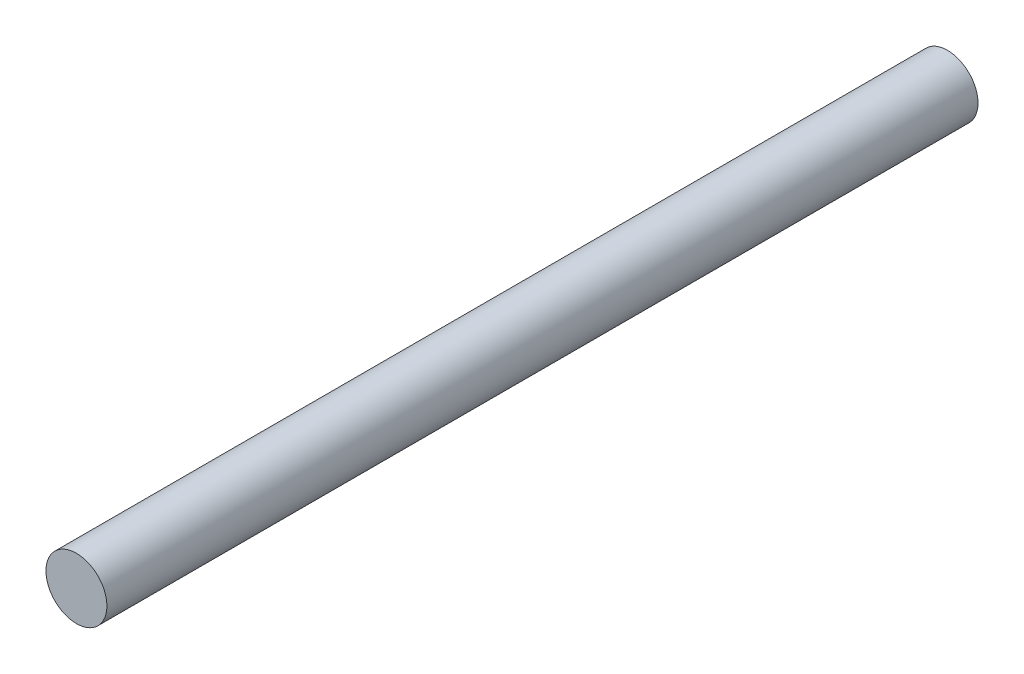
ISO-10303-21;
HEADER;
FILE_DESCRIPTION(('STEP AP214'),'2;1');
FILE_NAME('part.step','',(''),(''),'','','');
FILE_SCHEMA(('AUTOMOTIVE_DESIGN { 1 0 10303 214 1 1 1 1 }'));
ENDSEC;
DATA;
#1=APPLICATION_CONTEXT('core data for automotive mechanical design processes');
#2=APPLICATION_PROTOCOL_DEFINITION('international standard','automotive_design',2000,#1);
#3=PRODUCT_CONTEXT('',#1,'mechanical');
#4=PRODUCT('Part','Part','',(#3));
#5=PRODUCT_RELATED_PRODUCT_CATEGORY('part','',(#4));
#6=PRODUCT_DEFINITION_FORMATION('','',#4);
#7=PRODUCT_DEFINITION_CONTEXT('part definition',#1,'design');
#8=PRODUCT_DEFINITION('design','',#6,#7);
#9=PRODUCT_DEFINITION_SHAPE('','',#8);
#10=(LENGTH_UNIT() NAMED_UNIT(*) SI_UNIT(.MILLI.,.METRE.));
#11=(NAMED_UNIT(*) PLANE_ANGLE_UNIT() SI_UNIT($,.RADIAN.));
#12=(NAMED_UNIT(*) SI_UNIT($,.STERADIAN.) SOLID_ANGLE_UNIT());
#13=UNCERTAINTY_MEASURE_WITH_UNIT(LENGTH_MEASURE(1.E-05),#10,'distance_accuracy_value','');
#14=(GEOMETRIC_REPRESENTATION_CONTEXT(3) GLOBAL_UNCERTAINTY_ASSIGNED_CONTEXT((#13)) GLOBAL_UNIT_ASSIGNED_CONTEXT((#10,
#11,#12)) REPRESENTATION_CONTEXT('',''));
#15=CARTESIAN_POINT('',(0.,0.,0.));
#16=DIRECTION('',(0.,0.,1.));
#17=DIRECTION('',(1.,0.,0.));
#18=AXIS2_PLACEMENT_3D('',#15,#16,#17);
#19=CARTESIAN_POINT('',(0.,0.,18.));
#20=DIRECTION('',(0.,0.,-1.));
#21=DIRECTION('',(-1.,0.,0.));
#22=AXIS2_PLACEMENT_3D('',#19,#20,#21);
#23=CYLINDRICAL_SURFACE('',#22,0.63);
#24=CARTESIAN_POINT('',(0.,0.,18.));
#25=DIRECTION('',(0.,0.,1.));
#26=DIRECTION('',(1.,0.,0.));
#27=AXIS2_PLACEMENT_3D('',#24,#25,#26);
#28=CIRCLE('',#27,0.63);
#29=CARTESIAN_POINT('',(0.63,0.,18.));
#30=VERTEX_POINT('',#29);
#31=EDGE_CURVE('E10',#30,#30,#28,.T.);
#32=ORIENTED_EDGE('',*,*,#31,.F.);
#33=EDGE_LOOP('',(#32));
#34=FACE_BOUND('',#33,.T.);
#35=CARTESIAN_POINT('',(0.,0.,0.));
#36=DIRECTION('',(0.,0.,1.));
#37=DIRECTION('',(1.,0.,0.));
#38=AXIS2_PLACEMENT_3D('',#35,#36,#37);
#39=CIRCLE('',#38,0.63);
#40=CARTESIAN_POINT('',(0.63,0.,0.));
#41=VERTEX_POINT('',#40);
#42=EDGE_CURVE('E36',#41,#41,#39,.T.);
#43=ORIENTED_EDGE('',*,*,#42,.T.);
#44=EDGE_LOOP('',(#43));
#45=FACE_BOUND('',#44,.T.);
#46=ADVANCED_FACE('F33',(#34,#45),#23,.T.);
#47=CARTESIAN_POINT('',(0.,0.,18.));
#48=DIRECTION('',(0.,0.,1.));
#49=DIRECTION('',(1.,0.,0.));
#50=AXIS2_PLACEMENT_3D('',#47,#48,#49);
#51=PLANE('',#50);
#52=ORIENTED_EDGE('',*,*,#31,.T.);
#53=EDGE_LOOP('',(#52));
#54=FACE_BOUND('',#53,.T.);
#55=ADVANCED_FACE('F48',(#54),#51,.T.);
#56=CARTESIAN_POINT('',(0.,0.,0.));
#57=DIRECTION('',(0.,0.,1.));
#58=DIRECTION('',(1.,0.,0.));
#59=AXIS2_PLACEMENT_3D('',#56,#57,#58);
#60=PLANE('',#59);
#61=ORIENTED_EDGE('',*,*,#42,.F.);
#62=EDGE_LOOP('',(#61));
#63=FACE_BOUND('',#62,.T.);
#64=ADVANCED_FACE('F46',(#63),#60,.F.);
#65=CLOSED_SHELL('',(#46,#55,#64));
#66=MANIFOLD_SOLID_BREP('B2',#65);
#67=ADVANCED_BREP_SHAPE_REPRESENTATION('',(#18,#66),#14);
#68=SHAPE_DEFINITION_REPRESENTATION(#9,#67);
ENDSEC;
END-ISO-10303-21;
